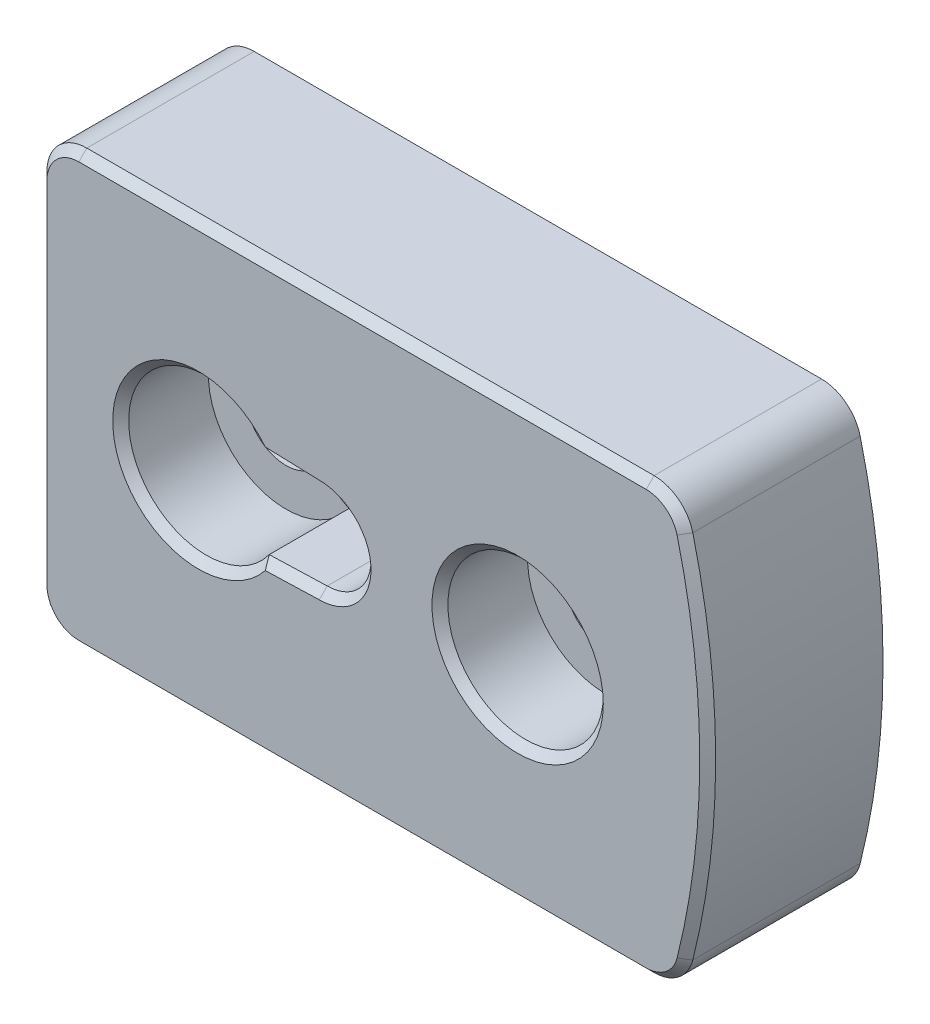
ISO-10303-21;
HEADER;
FILE_DESCRIPTION(('STEP AP214'),'2;1');
FILE_NAME('part.step','',(''),(''),'','','');
FILE_SCHEMA(('AUTOMOTIVE_DESIGN { 1 0 10303 214 1 1 1 1 }'));
ENDSEC;
DATA;
#1=APPLICATION_CONTEXT('core data for automotive mechanical design processes');
#2=APPLICATION_PROTOCOL_DEFINITION('international standard','automotive_design',2000,#1);
#3=PRODUCT_CONTEXT('',#1,'mechanical');
#4=PRODUCT('Part','Part','',(#3));
#5=PRODUCT_RELATED_PRODUCT_CATEGORY('part','',(#4));
#6=PRODUCT_DEFINITION_FORMATION('','',#4);
#7=PRODUCT_DEFINITION_CONTEXT('part definition',#1,'design');
#8=PRODUCT_DEFINITION('design','',#6,#7);
#9=PRODUCT_DEFINITION_SHAPE('','',#8);
#10=(LENGTH_UNIT() NAMED_UNIT(*) SI_UNIT(.MILLI.,.METRE.));
#11=(NAMED_UNIT(*) PLANE_ANGLE_UNIT() SI_UNIT($,.RADIAN.));
#12=(NAMED_UNIT(*) SI_UNIT($,.STERADIAN.) SOLID_ANGLE_UNIT());
#13=UNCERTAINTY_MEASURE_WITH_UNIT(LENGTH_MEASURE(1.E-05),#10,'distance_accuracy_value','');
#14=(GEOMETRIC_REPRESENTATION_CONTEXT(3) GLOBAL_UNCERTAINTY_ASSIGNED_CONTEXT((#13)) GLOBAL_UNIT_ASSIGNED_CONTEXT((#10,
#11,#12)) REPRESENTATION_CONTEXT('',''));
#15=CARTESIAN_POINT('',(0.,0.,0.));
#16=DIRECTION('',(0.,0.,1.));
#17=DIRECTION('',(1.,0.,0.));
#18=AXIS2_PLACEMENT_3D('',#15,#16,#17);
#19=CARTESIAN_POINT('',(10.026646141681,0.,0.));
#20=DIRECTION('',(0.,0.,1.));
#21=DIRECTION('',(1.,0.,0.));
#22=AXIS2_PLACEMENT_3D('',#19,#20,#21);
#23=CYLINDRICAL_SURFACE('',#22,2.5);
#24=CARTESIAN_POINT('',(10.026646141681,0.,0.));
#25=DIRECTION('',(0.,0.,1.));
#26=DIRECTION('',(1.,0.,0.));
#27=AXIS2_PLACEMENT_3D('',#24,#25,#26);
#28=CIRCLE('',#27,2.5);
#29=CARTESIAN_POINT('',(12.526646141681,0.,0.));
#30=VERTEX_POINT('',#29);
#31=EDGE_CURVE('E282',#30,#30,#28,.T.);
#32=ORIENTED_EDGE('',*,*,#31,.F.);
#33=EDGE_LOOP('',(#32));
#34=FACE_BOUND('',#33,.T.);
#35=CARTESIAN_POINT('',(10.026646141681,0.,5.5));
#36=DIRECTION('',(0.,0.,1.));
#37=DIRECTION('',(1.,0.,0.));
#38=AXIS2_PLACEMENT_3D('',#35,#36,#37);
#39=CIRCLE('',#38,2.5);
#40=CARTESIAN_POINT('',(12.526646141681,0.,5.5));
#41=VERTEX_POINT('',#40);
#42=EDGE_CURVE('E270',#41,#41,#39,.F.);
#43=ORIENTED_EDGE('',*,*,#42,.F.);
#44=EDGE_LOOP('',(#43));
#45=FACE_BOUND('',#44,.T.);
#46=ADVANCED_FACE('F45',(#34,#45),#23,.F.);
#47=CARTESIAN_POINT('',(-10.,0.,0.));
#48=DIRECTION('',(0.,0.,1.));
#49=DIRECTION('',(1.,0.,0.));
#50=AXIS2_PLACEMENT_3D('',#47,#48,#49);
#51=CYLINDRICAL_SURFACE('',#50,2.5);
#52=CARTESIAN_POINT('',(-10.,0.,0.));
#53=DIRECTION('',(0.,0.,1.));
#54=DIRECTION('',(1.,0.,0.));
#55=AXIS2_PLACEMENT_3D('',#52,#53,#54);
#56=CIRCLE('',#55,2.5);
#57=CARTESIAN_POINT('',(-7.5,0.,0.));
#58=VERTEX_POINT('',#57);
#59=EDGE_CURVE('E277',#58,#58,#56,.T.);
#60=ORIENTED_EDGE('',*,*,#59,.F.);
#61=EDGE_LOOP('',(#60));
#62=FACE_BOUND('',#61,.T.);
#63=CARTESIAN_POINT('',(-10.,0.,5.5));
#64=DIRECTION('',(0.,0.,1.));
#65=DIRECTION('',(1.,0.,0.));
#66=AXIS2_PLACEMENT_3D('',#63,#64,#65);
#67=CIRCLE('',#66,2.5);
#68=CARTESIAN_POINT('',(-7.5,0.,5.5));
#69=VERTEX_POINT('',#68);
#70=EDGE_CURVE('E264',#69,#69,#67,.F.);
#71=ORIENTED_EDGE('',*,*,#70,.F.);
#72=EDGE_LOOP('',(#71));
#73=FACE_BOUND('',#72,.T.);
#74=ADVANCED_FACE('F499',(#62,#73),#51,.F.);
#75=CARTESIAN_POINT('',(-25.755769230769,0.,11.));
#76=DIRECTION('',(0.,0.,-1.));
#77=DIRECTION('',(-1.,0.,0.));
#78=AXIS2_PLACEMENT_3D('',#75,#76,#77);
#79=CYLINDRICAL_SURFACE('',#78,47.705769230769);
#80=DIRECTION('',(0.,0.,-1.));
#81=VECTOR('',#80,1.);
#82=CARTESIAN_POINT('',(20.5161132212784,11.6083294337857,11.));
#83=LINE('',#82,#81);
#84=CARTESIAN_POINT('',(20.5161132212784,11.6083294337857,0.));
#85=VERTEX_POINT('',#84);
#86=CARTESIAN_POINT('',(20.5161132212784,11.6083294337857,10.5));
#87=VERTEX_POINT('',#86);
#88=EDGE_CURVE('E340',#85,#87,#83,.F.);
#89=ORIENTED_EDGE('',*,*,#88,.T.);
#90=CARTESIAN_POINT('',(-25.755769230769,0.,10.5));
#91=DIRECTION('',(0.,0.,1.));
#92=DIRECTION('',(1.,0.,0.));
#93=AXIS2_PLACEMENT_3D('',#90,#91,#92);
#94=CIRCLE('',#93,47.705769230769);
#95=CARTESIAN_POINT('',(20.5161132212784,-11.6083294337857,10.5));
#96=VERTEX_POINT('',#95);
#97=EDGE_CURVE('E385',#87,#96,#94,.F.);
#98=ORIENTED_EDGE('',*,*,#97,.T.);
#99=DIRECTION('',(0.,0.,-1.));
#100=VECTOR('',#99,1.);
#101=CARTESIAN_POINT('',(20.5161132212784,-11.6083294337857,11.));
#102=LINE('',#101,#100);
#103=CARTESIAN_POINT('',(20.5161132212784,-11.6083294337857,0.));
#104=VERTEX_POINT('',#103);
#105=EDGE_CURVE('E344',#96,#104,#102,.T.);
#106=ORIENTED_EDGE('',*,*,#105,.T.);
#107=CARTESIAN_POINT('',(-25.755769230769,0.,0.));
#108=DIRECTION('',(0.,0.,1.));
#109=DIRECTION('',(1.,0.,0.));
#110=AXIS2_PLACEMENT_3D('',#107,#108,#109);
#111=CIRCLE('',#110,47.705769230769);
#112=EDGE_CURVE('E281',#85,#104,#111,.F.);
#113=ORIENTED_EDGE('',*,*,#112,.F.);
#114=EDGE_LOOP('',(#89,#98,#106,#113));
#115=FACE_BOUND('',#114,.T.);
#116=ADVANCED_FACE('F505',(#115),#79,.T.);
#117=CARTESIAN_POINT('',(0.,13.5,11.));
#118=DIRECTION('',(0.,1.,0.));
#119=DIRECTION('',(0.,0.,1.));
#120=AXIS2_PLACEMENT_3D('',#117,#118,#119);
#121=PLANE('',#120);
#122=DIRECTION('',(0.,0.,-1.));
#123=VECTOR('',#122,1.);
#124=CARTESIAN_POINT('',(-17.5,13.5,11.));
#125=LINE('',#124,#123);
#126=CARTESIAN_POINT('',(-17.5,13.5,0.));
#127=VERTEX_POINT('',#126);
#128=CARTESIAN_POINT('',(-17.5,13.5,10.5));
#129=VERTEX_POINT('',#128);
#130=EDGE_CURVE('E336',#127,#129,#125,.F.);
#131=ORIENTED_EDGE('',*,*,#130,.T.);
#132=DIRECTION('',(1.,0.,0.));
#133=VECTOR('',#132,1.);
#134=CARTESIAN_POINT('',(0.,13.5,10.5));
#135=LINE('',#134,#133);
#136=CARTESIAN_POINT('',(18.0912554316359,13.5,10.5));
#137=VERTEX_POINT('',#136);
#138=EDGE_CURVE('E394',#129,#137,#135,.T.);
#139=ORIENTED_EDGE('',*,*,#138,.T.);
#140=DIRECTION('',(0.,0.,-1.));
#141=VECTOR('',#140,1.);
#142=CARTESIAN_POINT('',(18.0912554316359,13.5,11.));
#143=LINE('',#142,#141);
#144=CARTESIAN_POINT('',(18.0912554316359,13.5,0.));
#145=VERTEX_POINT('',#144);
#146=EDGE_CURVE('E333',#137,#145,#143,.T.);
#147=ORIENTED_EDGE('',*,*,#146,.T.);
#148=DIRECTION('',(1.,0.,0.));
#149=VECTOR('',#148,1.);
#150=CARTESIAN_POINT('',(0.,13.5,0.));
#151=LINE('',#150,#149);
#152=EDGE_CURVE('E289',#127,#145,#151,.T.);
#153=ORIENTED_EDGE('',*,*,#152,.F.);
#154=EDGE_LOOP('',(#131,#139,#147,#153));
#155=FACE_BOUND('',#154,.T.);
#156=ADVANCED_FACE('F527',(#155),#121,.T.);
#157=CARTESIAN_POINT('',(-20.,0.,11.));
#158=DIRECTION('',(-1.,0.,0.));
#159=DIRECTION('',(0.,0.,1.));
#160=AXIS2_PLACEMENT_3D('',#157,#158,#159);
#161=PLANE('',#160);
#162=DIRECTION('',(0.,0.,-1.));
#163=VECTOR('',#162,1.);
#164=CARTESIAN_POINT('',(-20.,-11.,11.));
#165=LINE('',#164,#163);
#166=CARTESIAN_POINT('',(-20.,-11.,0.));
#167=VERTEX_POINT('',#166);
#168=CARTESIAN_POINT('',(-20.,-11.,10.5));
#169=VERTEX_POINT('',#168);
#170=EDGE_CURVE('E329',#167,#169,#165,.F.);
#171=ORIENTED_EDGE('',*,*,#170,.T.);
#172=DIRECTION('',(0.,1.,0.));
#173=VECTOR('',#172,1.);
#174=CARTESIAN_POINT('',(-20.,0.,10.5));
#175=LINE('',#174,#173);
#176=CARTESIAN_POINT('',(-20.,11.,10.5));
#177=VERTEX_POINT('',#176);
#178=EDGE_CURVE('E382',#169,#177,#175,.T.);
#179=ORIENTED_EDGE('',*,*,#178,.T.);
#180=DIRECTION('',(0.,0.,-1.));
#181=VECTOR('',#180,1.);
#182=CARTESIAN_POINT('',(-20.,11.,11.));
#183=LINE('',#182,#181);
#184=CARTESIAN_POINT('',(-20.,11.,0.));
#185=VERTEX_POINT('',#184);
#186=EDGE_CURVE('E326',#177,#185,#183,.T.);
#187=ORIENTED_EDGE('',*,*,#186,.T.);
#188=DIRECTION('',(0.,1.,0.));
#189=VECTOR('',#188,1.);
#190=CARTESIAN_POINT('',(-20.,0.,0.));
#191=LINE('',#190,#189);
#192=EDGE_CURVE('E293',#167,#185,#191,.T.);
#193=ORIENTED_EDGE('',*,*,#192,.F.);
#194=EDGE_LOOP('',(#171,#179,#187,#193));
#195=FACE_BOUND('',#194,.T.);
#196=ADVANCED_FACE('F523',(#195),#161,.T.);
#197=CARTESIAN_POINT('',(0.,-13.5,11.));
#198=DIRECTION('',(0.,1.,0.));
#199=DIRECTION('',(0.,0.,1.));
#200=AXIS2_PLACEMENT_3D('',#197,#198,#199);
#201=PLANE('',#200);
#202=DIRECTION('',(0.,0.,1.));
#203=VECTOR('',#202,1.);
#204=CARTESIAN_POINT('',(18.0912554316359,-13.5,11.));
#205=LINE('',#204,#203);
#206=CARTESIAN_POINT('',(18.0912554316359,-13.5,0.));
#207=VERTEX_POINT('',#206);
#208=CARTESIAN_POINT('',(18.0912554316359,-13.5,10.5));
#209=VERTEX_POINT('',#208);
#210=EDGE_CURVE('E307',#207,#209,#205,.T.);
#211=ORIENTED_EDGE('',*,*,#210,.T.);
#212=DIRECTION('',(-1.,0.,0.));
#213=VECTOR('',#212,1.);
#214=CARTESIAN_POINT('',(-17.5,-13.5,10.5));
#215=LINE('',#214,#213);
#216=CARTESIAN_POINT('',(-17.5,-13.5,10.5));
#217=VERTEX_POINT('',#216);
#218=EDGE_CURVE('E372',#209,#217,#215,.T.);
#219=ORIENTED_EDGE('',*,*,#218,.T.);
#220=DIRECTION('',(0.,0.,-1.));
#221=VECTOR('',#220,1.);
#222=CARTESIAN_POINT('',(-17.5,-13.5,0.));
#223=LINE('',#222,#221);
#224=CARTESIAN_POINT('',(-17.5,-13.5,0.));
#225=VERTEX_POINT('',#224);
#226=EDGE_CURVE('E311',#217,#225,#223,.T.);
#227=ORIENTED_EDGE('',*,*,#226,.T.);
#228=DIRECTION('',(1.,0.,0.));
#229=VECTOR('',#228,1.);
#230=CARTESIAN_POINT('',(0.,-13.5,0.));
#231=LINE('',#230,#229);
#232=EDGE_CURVE('E297',#225,#207,#231,.T.);
#233=ORIENTED_EDGE('',*,*,#232,.T.);
#234=EDGE_LOOP('',(#211,#219,#227,#233));
#235=FACE_BOUND('',#234,.T.);
#236=ADVANCED_FACE('F516',(#235),#201,.F.);
#237=CARTESIAN_POINT('',(0.,0.,11.));
#238=DIRECTION('',(0.,0.,1.));
#239=DIRECTION('',(1.,0.,0.));
#240=AXIS2_PLACEMENT_3D('',#237,#238,#239);
#241=PLANE('',#240);
#242=CARTESIAN_POINT('',(10.026646141681,0.,11.));
#243=DIRECTION('',(0.,0.,1.));
#244=DIRECTION('',(1.,0.,0.));
#245=AXIS2_PLACEMENT_3D('',#242,#243,#244);
#246=CIRCLE('',#245,5.375);
#247=CARTESIAN_POINT('',(15.401646141681,0.,11.));
#248=VERTEX_POINT('',#247);
#249=EDGE_CURVE('E445',#248,#248,#246,.F.);
#250=ORIENTED_EDGE('',*,*,#249,.T.);
#251=EDGE_LOOP('',(#250));
#252=FACE_BOUND('',#251,.T.);
#253=CARTESIAN_POINT('',(-2.42,0.,11.));
#254=DIRECTION('',(0.,0.,1.));
#255=DIRECTION('',(1.,0.,0.));
#256=AXIS2_PLACEMENT_3D('',#253,#254,#255);
#257=CIRCLE('',#256,3.25);
#258=CARTESIAN_POINT('',(-2.4117086415491,3.24998942357901,11.));
#259=VERTEX_POINT('',#258);
#260=CARTESIAN_POINT('',(-2.41170864154912,-3.24998942357895,11.));
#261=VERTEX_POINT('',#260);
#262=EDGE_CURVE('E438',#259,#261,#257,.F.);
#263=ORIENTED_EDGE('',*,*,#262,.T.);
#264=DIRECTION('',(-0.999493332791074,-0.03182888163588,0.));
#265=VECTOR('',#264,1.);
#266=CARTESIAN_POINT('',(-6.04037816880582,-3.3655444644078,11.));
#267=LINE('',#266,#265);
#268=CARTESIAN_POINT('',(-5.80303035242447,-3.35798611928784,11.));
#269=VERTEX_POINT('',#268);
#270=EDGE_CURVE('E441',#261,#269,#267,.T.);
#271=ORIENTED_EDGE('',*,*,#270,.T.);
#272=CARTESIAN_POINT('',(-9.99999999999999,0.,11.));
#273=DIRECTION('',(0.,0.,1.));
#274=DIRECTION('',(1.,0.,0.));
#275=AXIS2_PLACEMENT_3D('',#272,#273,#274);
#276=CIRCLE('',#275,5.375);
#277=CARTESIAN_POINT('',(-5.80303035242447,3.35798611928784,11.));
#278=VERTEX_POINT('',#277);
#279=EDGE_CURVE('E432',#269,#278,#276,.F.);
#280=ORIENTED_EDGE('',*,*,#279,.T.);
#281=DIRECTION('',(0.999493332791074,-0.0318288816358789,0.));
#282=VECTOR('',#281,1.);
#283=CARTESIAN_POINT('',(-2.40408555918206,3.24974666639554,11.));
#284=LINE('',#283,#282);
#285=EDGE_CURVE('E435',#278,#259,#284,.T.);
#286=ORIENTED_EDGE('',*,*,#285,.T.);
#287=EDGE_LOOP('',(#263,#271,#280,#286));
#288=FACE_BOUND('',#287,.T.);
#289=CARTESIAN_POINT('',(-17.5,-11.,11.));
#290=DIRECTION('',(0.,0.,1.));
#291=DIRECTION('',(1.,0.,0.));
#292=AXIS2_PLACEMENT_3D('',#289,#290,#291);
#293=CIRCLE('',#292,1.99999999999999);
#294=CARTESIAN_POINT('',(-19.5,-11.,11.));
#295=VERTEX_POINT('',#294);
#296=CARTESIAN_POINT('',(-17.5,-13.,11.));
#297=VERTEX_POINT('',#296);
#298=EDGE_CURVE('E365',#295,#297,#293,.T.);
#299=ORIENTED_EDGE('',*,*,#298,.T.);
#300=DIRECTION('',(1.,0.,0.));
#301=VECTOR('',#300,1.);
#302=CARTESIAN_POINT('',(18.0912554316359,-13.,11.));
#303=LINE('',#302,#301);
#304=CARTESIAN_POINT('',(18.0912554316359,-13.,11.));
#305=VERTEX_POINT('',#304);
#306=EDGE_CURVE('E368',#297,#305,#303,.T.);
#307=ORIENTED_EDGE('',*,*,#306,.T.);
#308=CARTESIAN_POINT('',(18.0912554316359,-11.,11.));
#309=DIRECTION('',(0.,0.,1.));
#310=DIRECTION('',(1.,0.,0.));
#311=AXIS2_PLACEMENT_3D('',#308,#309,#310);
#312=CIRCLE('',#311,1.99999999999999);
#313=CARTESIAN_POINT('',(20.0311416633499,-11.4866635470285,11.));
#314=VERTEX_POINT('',#313);
#315=EDGE_CURVE('E362',#305,#314,#312,.T.);
#316=ORIENTED_EDGE('',*,*,#315,.T.);
#317=CARTESIAN_POINT('',(-25.755769230769,0.,11.));
#318=DIRECTION('',(0.,0.,1.));
#319=DIRECTION('',(1.,0.,0.));
#320=AXIS2_PLACEMENT_3D('',#317,#318,#319);
#321=CIRCLE('',#320,47.205769230769);
#322=CARTESIAN_POINT('',(20.0311416633499,11.4866635470285,11.));
#323=VERTEX_POINT('',#322);
#324=EDGE_CURVE('E356',#314,#323,#321,.T.);
#325=ORIENTED_EDGE('',*,*,#324,.T.);
#326=CARTESIAN_POINT('',(18.0912554316359,11.,11.));
#327=DIRECTION('',(0.,0.,1.));
#328=DIRECTION('',(1.,0.,0.));
#329=AXIS2_PLACEMENT_3D('',#326,#327,#328);
#330=CIRCLE('',#329,1.99999999999999);
#331=CARTESIAN_POINT('',(18.0912554316359,13.,11.));
#332=VERTEX_POINT('',#331);
#333=EDGE_CURVE('E350',#323,#332,#330,.T.);
#334=ORIENTED_EDGE('',*,*,#333,.T.);
#335=DIRECTION('',(-1.,0.,0.));
#336=VECTOR('',#335,1.);
#337=CARTESIAN_POINT('',(0.,13.,11.));
#338=LINE('',#337,#336);
#339=CARTESIAN_POINT('',(-17.5,13.,11.));
#340=VERTEX_POINT('',#339);
#341=EDGE_CURVE('E347',#332,#340,#338,.T.);
#342=ORIENTED_EDGE('',*,*,#341,.T.);
#343=CARTESIAN_POINT('',(-17.5,11.,11.));
#344=DIRECTION('',(0.,0.,1.));
#345=DIRECTION('',(1.,0.,0.));
#346=AXIS2_PLACEMENT_3D('',#343,#344,#345);
#347=CIRCLE('',#346,1.99999999999999);
#348=CARTESIAN_POINT('',(-19.5,11.,11.));
#349=VERTEX_POINT('',#348);
#350=EDGE_CURVE('E353',#340,#349,#347,.T.);
#351=ORIENTED_EDGE('',*,*,#350,.T.);
#352=DIRECTION('',(0.,-1.,0.));
#353=VECTOR('',#352,1.);
#354=CARTESIAN_POINT('',(-19.5,0.,11.));
#355=LINE('',#354,#353);
#356=EDGE_CURVE('E359',#349,#295,#355,.T.);
#357=ORIENTED_EDGE('',*,*,#356,.T.);
#358=EDGE_LOOP('',(#299,#307,#316,#325,#334,#342,#351,#357));
#359=FACE_BOUND('',#358,.T.);
#360=ADVANCED_FACE('F512',(#252,#288,#359),#241,.T.);
#361=CARTESIAN_POINT('',(0.,0.,0.));
#362=DIRECTION('',(0.,0.,1.));
#363=DIRECTION('',(1.,0.,0.));
#364=AXIS2_PLACEMENT_3D('',#361,#362,#363);
#365=PLANE('',#364);
#366=DIRECTION('',(0.866025403784439,0.5,0.));
#367=VECTOR('',#366,1.);
#368=CARTESIAN_POINT('',(-6.72,2.48260615751539,0.));
#369=LINE('',#368,#367);
#370=CARTESIAN_POINT('',(-6.72,2.48260615751539,0.));
#371=VERTEX_POINT('',#370);
#372=CARTESIAN_POINT('',(-2.42,4.96521231503078,0.));
#373=VERTEX_POINT('',#372);
#374=EDGE_CURVE('E749',#371,#373,#369,.T.);
#375=ORIENTED_EDGE('',*,*,#374,.F.);
#376=DIRECTION('',(0.,1.,0.));
#377=VECTOR('',#376,1.);
#378=CARTESIAN_POINT('',(-6.72,-2.48260615751539,0.));
#379=LINE('',#378,#377);
#380=CARTESIAN_POINT('',(-6.72,-2.48260615751539,0.));
#381=VERTEX_POINT('',#380);
#382=EDGE_CURVE('E752',#381,#371,#379,.T.);
#383=ORIENTED_EDGE('',*,*,#382,.F.);
#384=DIRECTION('',(-0.866025403784439,0.5,0.));
#385=VECTOR('',#384,1.);
#386=CARTESIAN_POINT('',(-2.42,-4.96521231503078,0.));
#387=LINE('',#386,#385);
#388=CARTESIAN_POINT('',(-2.42,-4.96521231503078,0.));
#389=VERTEX_POINT('',#388);
#390=EDGE_CURVE('E428',#389,#381,#387,.T.);
#391=ORIENTED_EDGE('',*,*,#390,.F.);
#392=DIRECTION('',(-0.866025403784439,-0.5,0.));
#393=VECTOR('',#392,1.);
#394=CARTESIAN_POINT('',(1.88,-2.48260615751539,0.));
#395=LINE('',#394,#393);
#396=CARTESIAN_POINT('',(1.88,-2.48260615751539,0.));
#397=VERTEX_POINT('',#396);
#398=EDGE_CURVE('E737',#397,#389,#395,.T.);
#399=ORIENTED_EDGE('',*,*,#398,.F.);
#400=DIRECTION('',(0.,-1.,0.));
#401=VECTOR('',#400,1.);
#402=CARTESIAN_POINT('',(1.88,2.48260615751539,0.));
#403=LINE('',#402,#401);
#404=CARTESIAN_POINT('',(1.88,2.48260615751539,0.));
#405=VERTEX_POINT('',#404);
#406=EDGE_CURVE('E741',#405,#397,#403,.T.);
#407=ORIENTED_EDGE('',*,*,#406,.F.);
#408=DIRECTION('',(0.866025403784439,-0.5,0.));
#409=VECTOR('',#408,1.);
#410=CARTESIAN_POINT('',(-2.42,4.96521231503078,0.));
#411=LINE('',#410,#409);
#412=EDGE_CURVE('E745',#373,#405,#411,.T.);
#413=ORIENTED_EDGE('',*,*,#412,.F.);
#414=EDGE_LOOP('',(#375,#383,#391,#399,#407,#413));
#415=FACE_BOUND('',#414,.T.);
#416=ORIENTED_EDGE('',*,*,#59,.T.);
#417=EDGE_LOOP('',(#416));
#418=FACE_BOUND('',#417,.T.);
#419=ORIENTED_EDGE('',*,*,#31,.T.);
#420=EDGE_LOOP('',(#419));
#421=FACE_BOUND('',#420,.T.);
#422=ORIENTED_EDGE('',*,*,#232,.F.);
#423=CARTESIAN_POINT('',(-17.5,-11.,0.));
#424=DIRECTION('',(0.,0.,1.));
#425=DIRECTION('',(1.,0.,0.));
#426=AXIS2_PLACEMENT_3D('',#423,#424,#425);
#427=CIRCLE('',#426,2.5);
#428=EDGE_CURVE('E323',#225,#167,#427,.F.);
#429=ORIENTED_EDGE('',*,*,#428,.T.);
#430=ORIENTED_EDGE('',*,*,#192,.T.);
#431=CARTESIAN_POINT('',(-17.5,11.,0.));
#432=DIRECTION('',(0.,0.,1.));
#433=DIRECTION('',(1.,0.,0.));
#434=AXIS2_PLACEMENT_3D('',#431,#432,#433);
#435=CIRCLE('',#434,2.5);
#436=EDGE_CURVE('E320',#185,#127,#435,.F.);
#437=ORIENTED_EDGE('',*,*,#436,.T.);
#438=ORIENTED_EDGE('',*,*,#152,.T.);
#439=CARTESIAN_POINT('',(18.0912554316359,11.,0.));
#440=DIRECTION('',(0.,0.,1.));
#441=DIRECTION('',(1.,0.,0.));
#442=AXIS2_PLACEMENT_3D('',#439,#440,#441);
#443=CIRCLE('',#442,2.5);
#444=EDGE_CURVE('E314',#145,#85,#443,.F.);
#445=ORIENTED_EDGE('',*,*,#444,.T.);
#446=ORIENTED_EDGE('',*,*,#112,.T.);
#447=CARTESIAN_POINT('',(18.0912554316359,-11.,0.));
#448=DIRECTION('',(0.,0.,1.));
#449=DIRECTION('',(1.,0.,0.));
#450=AXIS2_PLACEMENT_3D('',#447,#448,#449);
#451=CIRCLE('',#450,2.5);
#452=EDGE_CURVE('E317',#104,#207,#451,.F.);
#453=ORIENTED_EDGE('',*,*,#452,.T.);
#454=EDGE_LOOP('',(#422,#429,#430,#437,#438,#445,#446,#453));
#455=FACE_BOUND('',#454,.T.);
#456=ADVANCED_FACE('F515',(#415,#418,#421,#455),#365,.F.);
#457=CARTESIAN_POINT('',(0.,0.,5.5));
#458=DIRECTION('',(0.,0.,1.));
#459=DIRECTION('',(1.,0.,0.));
#460=AXIS2_PLACEMENT_3D('',#457,#458,#459);
#461=PLANE('',#460);
#462=DIRECTION('',(0.866025403784439,0.5,0.));
#463=VECTOR('',#462,1.);
#464=CARTESIAN_POINT('',(-6.72,2.48260615751539,5.5));
#465=LINE('',#464,#463);
#466=CARTESIAN_POINT('',(-6.72,2.48260615751539,5.5));
#467=VERTEX_POINT('',#466);
#468=CARTESIAN_POINT('',(-6.05629260962376,2.86579779801226,5.5));
#469=VERTEX_POINT('',#468);
#470=EDGE_CURVE('E262',#467,#469,#465,.T.);
#471=ORIENTED_EDGE('',*,*,#470,.T.);
#472=CARTESIAN_POINT('',(-9.99999999999999,0.,5.5));
#473=DIRECTION('',(0.,0.,1.));
#474=DIRECTION('',(1.,0.,0.));
#475=AXIS2_PLACEMENT_3D('',#472,#473,#474);
#476=CIRCLE('',#475,4.875);
#477=CARTESIAN_POINT('',(-6.05629260962376,-2.86579779801226,5.5));
#478=VERTEX_POINT('',#477);
#479=EDGE_CURVE('E234',#478,#469,#476,.F.);
#480=ORIENTED_EDGE('',*,*,#479,.F.);
#481=DIRECTION('',(-0.866025403784439,0.5,0.));
#482=VECTOR('',#481,1.);
#483=CARTESIAN_POINT('',(-2.42,-4.96521231503078,5.5));
#484=LINE('',#483,#482);
#485=CARTESIAN_POINT('',(-6.72,-2.48260615751539,5.5));
#486=VERTEX_POINT('',#485);
#487=EDGE_CURVE('E242',#478,#486,#484,.T.);
#488=ORIENTED_EDGE('',*,*,#487,.T.);
#489=DIRECTION('',(0.,1.,0.));
#490=VECTOR('',#489,1.);
#491=CARTESIAN_POINT('',(-6.72,-2.48260615751539,5.5));
#492=LINE('',#491,#490);
#493=EDGE_CURVE('E740',#486,#467,#492,.T.);
#494=ORIENTED_EDGE('',*,*,#493,.T.);
#495=EDGE_LOOP('',(#471,#480,#488,#494));
#496=FACE_BOUND('',#495,.T.);
#497=ORIENTED_EDGE('',*,*,#70,.T.);
#498=EDGE_LOOP('',(#497));
#499=FACE_BOUND('',#498,.T.);
#500=ADVANCED_FACE('F260',(#496,#499),#461,.T.);
#501=CARTESIAN_POINT('',(-9.99999999999999,0.,-13.7885822331377));
#502=DIRECTION('',(0.,0.,1.));
#503=DIRECTION('',(1.,0.,0.));
#504=AXIS2_PLACEMENT_3D('',#501,#502,#503);
#505=CYLINDRICAL_SURFACE('',#504,4.875);
#506=DIRECTION('',(0.,0.,1.));
#507=VECTOR('',#506,1.);
#508=CARTESIAN_POINT('',(-6.05629260962376,2.86579779801225,0.));
#509=LINE('',#508,#507);
#510=CARTESIAN_POINT('',(-6.05629260962376,2.86579779801225,10.5));
#511=VERTEX_POINT('',#510);
#512=EDGE_CURVE('E237',#469,#511,#509,.T.);
#513=ORIENTED_EDGE('',*,*,#512,.T.);
#514=CARTESIAN_POINT('',(-9.99999999999999,0.,10.5));
#515=DIRECTION('',(0.,0.,1.));
#516=DIRECTION('',(1.,0.,0.));
#517=AXIS2_PLACEMENT_3D('',#514,#515,#516);
#518=CIRCLE('',#517,4.875);
#519=CARTESIAN_POINT('',(-6.05629260962376,-2.86579779801226,10.5));
#520=VERTEX_POINT('',#519);
#521=EDGE_CURVE('E12',#511,#520,#518,.T.);
#522=ORIENTED_EDGE('',*,*,#521,.T.);
#523=DIRECTION('',(0.,0.,1.));
#524=VECTOR('',#523,1.);
#525=CARTESIAN_POINT('',(-6.05629260962376,-2.86579779801226,0.));
#526=LINE('',#525,#524);
#527=EDGE_CURVE('E219',#478,#520,#526,.T.);
#528=ORIENTED_EDGE('',*,*,#527,.F.);
#529=ORIENTED_EDGE('',*,*,#479,.T.);
#530=EDGE_LOOP('',(#513,#522,#528,#529));
#531=FACE_BOUND('',#530,.T.);
#532=ADVANCED_FACE('F232',(#531),#505,.F.);
#533=CARTESIAN_POINT('',(0.,0.,5.5));
#534=DIRECTION('',(0.,0.,1.));
#535=DIRECTION('',(1.,0.,0.));
#536=AXIS2_PLACEMENT_3D('',#533,#534,#535);
#537=PLANE('',#536);
#538=CARTESIAN_POINT('',(10.026646141681,0.,5.5));
#539=DIRECTION('',(0.,0.,1.));
#540=DIRECTION('',(1.,0.,0.));
#541=AXIS2_PLACEMENT_3D('',#538,#539,#540);
#542=CIRCLE('',#541,4.875);
#543=CARTESIAN_POINT('',(14.901646141681,0.,5.5));
#544=VERTEX_POINT('',#543);
#545=EDGE_CURVE('E265',#544,#544,#542,.F.);
#546=ORIENTED_EDGE('',*,*,#545,.F.);
#547=EDGE_LOOP('',(#546));
#548=FACE_BOUND('',#547,.T.);
#549=ORIENTED_EDGE('',*,*,#42,.T.);
#550=EDGE_LOOP('',(#549));
#551=FACE_BOUND('',#550,.T.);
#552=ADVANCED_FACE('F624',(#548,#551),#537,.T.);
#553=CARTESIAN_POINT('',(10.026646141681,0.,-13.7885822331377));
#554=DIRECTION('',(0.,0.,1.));
#555=DIRECTION('',(1.,0.,0.));
#556=AXIS2_PLACEMENT_3D('',#553,#554,#555);
#557=CYLINDRICAL_SURFACE('',#556,4.875);
#558=CARTESIAN_POINT('',(10.026646141681,0.,10.5));
#559=DIRECTION('',(0.,0.,1.));
#560=DIRECTION('',(1.,0.,0.));
#561=AXIS2_PLACEMENT_3D('',#558,#559,#560);
#562=CIRCLE('',#561,4.875);
#563=CARTESIAN_POINT('',(14.901646141681,0.,10.5));
#564=VERTEX_POINT('',#563);
#565=EDGE_CURVE('E397',#564,#564,#562,.T.);
#566=ORIENTED_EDGE('',*,*,#565,.T.);
#567=EDGE_LOOP('',(#566));
#568=FACE_BOUND('',#567,.T.);
#569=ORIENTED_EDGE('',*,*,#545,.T.);
#570=EDGE_LOOP('',(#569));
#571=FACE_BOUND('',#570,.T.);
#572=ADVANCED_FACE('F620',(#568,#571),#557,.F.);
#573=CARTESIAN_POINT('',(-2.42,0.,0.));
#574=DIRECTION('',(0.,0.,1.));
#575=DIRECTION('',(1.,0.,0.));
#576=AXIS2_PLACEMENT_3D('',#573,#574,#575);
#577=CYLINDRICAL_SURFACE('',#576,2.75);
#578=DIRECTION('',(0.,0.,1.));
#579=VECTOR('',#578,1.);
#580=CARTESIAN_POINT('',(-2.42,-2.75,0.));
#581=LINE('',#580,#579);
#582=CARTESIAN_POINT('',(-2.42,-2.75,5.5));
#583=VERTEX_POINT('',#582);
#584=CARTESIAN_POINT('',(-2.42,-2.75,10.5));
#585=VERTEX_POINT('',#584);
#586=EDGE_CURVE('E221',#583,#585,#581,.T.);
#587=ORIENTED_EDGE('',*,*,#586,.T.);
#588=CARTESIAN_POINT('',(-2.42,0.,10.5));
#589=DIRECTION('',(0.,0.,1.));
#590=DIRECTION('',(1.,0.,0.));
#591=AXIS2_PLACEMENT_3D('',#588,#589,#590);
#592=CIRCLE('',#591,2.75);
#593=CARTESIAN_POINT('',(-2.42,2.75,10.5));
#594=VERTEX_POINT('',#593);
#595=EDGE_CURVE('E76',#585,#594,#592,.T.);
#596=ORIENTED_EDGE('',*,*,#595,.T.);
#597=DIRECTION('',(0.,0.,1.));
#598=VECTOR('',#597,1.);
#599=CARTESIAN_POINT('',(-2.42,2.75,0.));
#600=LINE('',#599,#598);
#601=CARTESIAN_POINT('',(-2.42,2.75,5.5));
#602=VERTEX_POINT('',#601);
#603=EDGE_CURVE('E667',#602,#594,#600,.T.);
#604=ORIENTED_EDGE('',*,*,#603,.F.);
#605=CARTESIAN_POINT('',(-2.42,0.,5.5));
#606=DIRECTION('',(0.,0.,1.));
#607=DIRECTION('',(1.,0.,0.));
#608=AXIS2_PLACEMENT_3D('',#605,#606,#607);
#609=CIRCLE('',#608,2.75);
#610=EDGE_CURVE('E300',#602,#583,#609,.F.);
#611=ORIENTED_EDGE('',*,*,#610,.T.);
#612=EDGE_LOOP('',(#587,#596,#604,#611));
#613=FACE_BOUND('',#612,.T.);
#614=ADVANCED_FACE('F623',(#613),#577,.F.);
#615=CARTESIAN_POINT('',(0.,0.,5.5));
#616=DIRECTION('',(0.,0.,1.));
#617=DIRECTION('',(1.,0.,0.));
#618=AXIS2_PLACEMENT_3D('',#615,#616,#617);
#619=PLANE('',#618);
#620=CARTESIAN_POINT('',(-2.42,-4.96521231503078,5.5));
#621=VERTEX_POINT('',#620);
#622=EDGE_CURVE('E245',#621,#478,#484,.T.);
#623=ORIENTED_EDGE('',*,*,#622,.T.);
#624=DIRECTION('',(0.999493332791074,0.03182888163588,0.));
#625=VECTOR('',#624,1.);
#626=CARTESIAN_POINT('',(0.0850334281604785,-2.67022716924365,5.5));
#627=LINE('',#626,#625);
#628=EDGE_CURVE('E215',#478,#583,#627,.T.);
#629=ORIENTED_EDGE('',*,*,#628,.T.);
#630=ORIENTED_EDGE('',*,*,#610,.F.);
#631=DIRECTION('',(-0.999493332791074,0.0318288816358789,0.));
#632=VECTOR('',#631,1.);
#633=CARTESIAN_POINT('',(0.0850334281604757,2.67022716924365,5.5));
#634=LINE('',#633,#632);
#635=EDGE_CURVE('E227',#602,#469,#634,.T.);
#636=ORIENTED_EDGE('',*,*,#635,.T.);
#637=CARTESIAN_POINT('',(-2.42,4.96521231503078,5.5));
#638=VERTEX_POINT('',#637);
#639=EDGE_CURVE('E775',#469,#638,#465,.T.);
#640=ORIENTED_EDGE('',*,*,#639,.T.);
#641=DIRECTION('',(0.866025403784439,-0.5,0.));
#642=VECTOR('',#641,1.);
#643=CARTESIAN_POINT('',(-2.42,4.96521231503078,5.5));
#644=LINE('',#643,#642);
#645=CARTESIAN_POINT('',(1.88,2.48260615751539,5.5));
#646=VERTEX_POINT('',#645);
#647=EDGE_CURVE('E768',#638,#646,#644,.T.);
#648=ORIENTED_EDGE('',*,*,#647,.T.);
#649=DIRECTION('',(0.,-1.,0.));
#650=VECTOR('',#649,1.);
#651=CARTESIAN_POINT('',(1.88,2.48260615751539,5.5));
#652=LINE('',#651,#650);
#653=CARTESIAN_POINT('',(1.88,-2.48260615751539,5.5));
#654=VERTEX_POINT('',#653);
#655=EDGE_CURVE('E764',#646,#654,#652,.T.);
#656=ORIENTED_EDGE('',*,*,#655,.T.);
#657=DIRECTION('',(-0.866025403784439,-0.5,0.));
#658=VECTOR('',#657,1.);
#659=CARTESIAN_POINT('',(1.88,-2.48260615751539,5.5));
#660=LINE('',#659,#658);
#661=EDGE_CURVE('E257',#654,#621,#660,.T.);
#662=ORIENTED_EDGE('',*,*,#661,.T.);
#663=EDGE_LOOP('',(#623,#629,#630,#636,#640,#648,#656,#662));
#664=FACE_BOUND('',#663,.T.);
#665=ADVANCED_FACE('F255',(#664),#619,.F.);
#666=CARTESIAN_POINT('',(-6.72,-2.48260615751539,18.6367169922067));
#667=DIRECTION('',(-1.,0.,0.));
#668=DIRECTION('',(0.,-1.,0.));
#669=AXIS2_PLACEMENT_3D('',#666,#667,#668);
#670=PLANE('',#669);
#671=DIRECTION('',(0.,0.,-1.));
#672=VECTOR('',#671,1.);
#673=CARTESIAN_POINT('',(-6.72,-2.48260615751539,18.6367169922067));
#674=LINE('',#673,#672);
#675=EDGE_CURVE('E248',#486,#381,#674,.T.);
#676=ORIENTED_EDGE('',*,*,#675,.T.);
#677=ORIENTED_EDGE('',*,*,#382,.T.);
#678=DIRECTION('',(0.,0.,-1.));
#679=VECTOR('',#678,1.);
#680=CARTESIAN_POINT('',(-6.72,2.48260615751539,18.6367169922067));
#681=LINE('',#680,#679);
#682=EDGE_CURVE('E759',#467,#371,#681,.T.);
#683=ORIENTED_EDGE('',*,*,#682,.F.);
#684=ORIENTED_EDGE('',*,*,#493,.F.);
#685=EDGE_LOOP('',(#676,#677,#683,#684));
#686=FACE_BOUND('',#685,.T.);
#687=ADVANCED_FACE('F642',(#686),#670,.F.);
#688=CARTESIAN_POINT('',(-6.72,2.48260615751539,18.6367169922067));
#689=DIRECTION('',(-0.5,0.866025403784439,0.));
#690=DIRECTION('',(-0.866025403784439,-0.5,0.));
#691=AXIS2_PLACEMENT_3D('',#688,#689,#690);
#692=PLANE('',#691);
#693=ORIENTED_EDGE('',*,*,#639,.F.);
#694=ORIENTED_EDGE('',*,*,#470,.F.);
#695=ORIENTED_EDGE('',*,*,#682,.T.);
#696=ORIENTED_EDGE('',*,*,#374,.T.);
#697=DIRECTION('',(0.,0.,-1.));
#698=VECTOR('',#697,1.);
#699=CARTESIAN_POINT('',(-2.42,4.96521231503078,18.6367169922067));
#700=LINE('',#699,#698);
#701=EDGE_CURVE('E772',#638,#373,#700,.T.);
#702=ORIENTED_EDGE('',*,*,#701,.F.);
#703=EDGE_LOOP('',(#693,#694,#695,#696,#702));
#704=FACE_BOUND('',#703,.T.);
#705=ADVANCED_FACE('F645',(#704),#692,.F.);
#706=CARTESIAN_POINT('',(-2.42,4.96521231503078,18.6367169922067));
#707=DIRECTION('',(0.5,0.866025403784439,0.));
#708=DIRECTION('',(-0.866025403784439,0.5,0.));
#709=AXIS2_PLACEMENT_3D('',#706,#707,#708);
#710=PLANE('',#709);
#711=ORIENTED_EDGE('',*,*,#701,.T.);
#712=ORIENTED_EDGE('',*,*,#412,.T.);
#713=DIRECTION('',(0.,0.,-1.));
#714=VECTOR('',#713,1.);
#715=CARTESIAN_POINT('',(1.88,2.48260615751539,18.6367169922067));
#716=LINE('',#715,#714);
#717=EDGE_CURVE('E767',#646,#405,#716,.T.);
#718=ORIENTED_EDGE('',*,*,#717,.F.);
#719=ORIENTED_EDGE('',*,*,#647,.F.);
#720=EDGE_LOOP('',(#711,#712,#718,#719));
#721=FACE_BOUND('',#720,.T.);
#722=ADVANCED_FACE('F649',(#721),#710,.F.);
#723=CARTESIAN_POINT('',(1.88,2.48260615751539,18.6367169922067));
#724=DIRECTION('',(1.,0.,0.));
#725=DIRECTION('',(0.,1.,0.));
#726=AXIS2_PLACEMENT_3D('',#723,#724,#725);
#727=PLANE('',#726);
#728=ORIENTED_EDGE('',*,*,#717,.T.);
#729=ORIENTED_EDGE('',*,*,#406,.T.);
#730=DIRECTION('',(0.,0.,-1.));
#731=VECTOR('',#730,1.);
#732=CARTESIAN_POINT('',(1.88,-2.48260615751539,18.6367169922067));
#733=LINE('',#732,#731);
#734=EDGE_CURVE('E763',#654,#397,#733,.T.);
#735=ORIENTED_EDGE('',*,*,#734,.F.);
#736=ORIENTED_EDGE('',*,*,#655,.F.);
#737=EDGE_LOOP('',(#728,#729,#735,#736));
#738=FACE_BOUND('',#737,.T.);
#739=ADVANCED_FACE('F653',(#738),#727,.F.);
#740=CARTESIAN_POINT('',(1.88,-2.48260615751539,18.6367169922067));
#741=DIRECTION('',(0.5,-0.866025403784439,0.));
#742=DIRECTION('',(0.866025403784439,0.5,0.));
#743=AXIS2_PLACEMENT_3D('',#740,#741,#742);
#744=PLANE('',#743);
#745=ORIENTED_EDGE('',*,*,#734,.T.);
#746=ORIENTED_EDGE('',*,*,#398,.T.);
#747=DIRECTION('',(0.,0.,-1.));
#748=VECTOR('',#747,1.);
#749=CARTESIAN_POINT('',(-2.42,-4.96521231503078,18.6367169922067));
#750=LINE('',#749,#748);
#751=EDGE_CURVE('E252',#621,#389,#750,.T.);
#752=ORIENTED_EDGE('',*,*,#751,.F.);
#753=ORIENTED_EDGE('',*,*,#661,.F.);
#754=EDGE_LOOP('',(#745,#746,#752,#753));
#755=FACE_BOUND('',#754,.T.);
#756=ADVANCED_FACE('F657',(#755),#744,.F.);
#757=CARTESIAN_POINT('',(-2.42,-4.96521231503078,18.6367169922067));
#758=DIRECTION('',(-0.5,-0.866025403784439,0.));
#759=DIRECTION('',(0.866025403784439,-0.5,0.));
#760=AXIS2_PLACEMENT_3D('',#757,#758,#759);
#761=PLANE('',#760);
#762=ORIENTED_EDGE('',*,*,#390,.T.);
#763=ORIENTED_EDGE('',*,*,#675,.F.);
#764=ORIENTED_EDGE('',*,*,#487,.F.);
#765=ORIENTED_EDGE('',*,*,#622,.F.);
#766=ORIENTED_EDGE('',*,*,#751,.T.);
#767=EDGE_LOOP('',(#762,#763,#764,#765,#766));
#768=FACE_BOUND('',#767,.T.);
#769=ADVANCED_FACE('F243',(#768),#761,.F.);
#770=CARTESIAN_POINT('',(-17.5,-11.,11.));
#771=DIRECTION('',(0.,0.,1.));
#772=DIRECTION('',(1.,0.,0.));
#773=AXIS2_PLACEMENT_3D('',#770,#771,#772);
#774=CYLINDRICAL_SURFACE('',#773,2.5);
#775=ORIENTED_EDGE('',*,*,#226,.F.);
#776=CARTESIAN_POINT('',(-17.5,-11.,10.5));
#777=DIRECTION('',(0.,0.,1.));
#778=DIRECTION('',(1.,0.,0.));
#779=AXIS2_PLACEMENT_3D('',#776,#777,#778);
#780=CIRCLE('',#779,2.5);
#781=EDGE_CURVE('E376',#217,#169,#780,.F.);
#782=ORIENTED_EDGE('',*,*,#781,.T.);
#783=ORIENTED_EDGE('',*,*,#170,.F.);
#784=ORIENTED_EDGE('',*,*,#428,.F.);
#785=EDGE_LOOP('',(#775,#782,#783,#784));
#786=FACE_BOUND('',#785,.T.);
#787=ADVANCED_FACE('F535',(#786),#774,.T.);
#788=CARTESIAN_POINT('',(-17.5,11.,11.));
#789=DIRECTION('',(0.,0.,-1.));
#790=DIRECTION('',(-1.,0.,0.));
#791=AXIS2_PLACEMENT_3D('',#788,#789,#790);
#792=CYLINDRICAL_SURFACE('',#791,2.5);
#793=ORIENTED_EDGE('',*,*,#186,.F.);
#794=CARTESIAN_POINT('',(-17.5,11.,10.5));
#795=DIRECTION('',(0.,0.,1.));
#796=DIRECTION('',(1.,0.,0.));
#797=AXIS2_PLACEMENT_3D('',#794,#795,#796);
#798=CIRCLE('',#797,2.5);
#799=EDGE_CURVE('E388',#177,#129,#798,.F.);
#800=ORIENTED_EDGE('',*,*,#799,.T.);
#801=ORIENTED_EDGE('',*,*,#130,.F.);
#802=ORIENTED_EDGE('',*,*,#436,.F.);
#803=EDGE_LOOP('',(#793,#800,#801,#802));
#804=FACE_BOUND('',#803,.T.);
#805=ADVANCED_FACE('F538',(#804),#792,.T.);
#806=CARTESIAN_POINT('',(18.0912554316359,-11.,11.));
#807=DIRECTION('',(0.,0.,-1.));
#808=DIRECTION('',(-1.,0.,0.));
#809=AXIS2_PLACEMENT_3D('',#806,#807,#808);
#810=CYLINDRICAL_SURFACE('',#809,2.5);
#811=ORIENTED_EDGE('',*,*,#105,.F.);
#812=CARTESIAN_POINT('',(18.0912554316359,-11.,10.5));
#813=DIRECTION('',(0.,0.,1.));
#814=DIRECTION('',(1.,0.,0.));
#815=AXIS2_PLACEMENT_3D('',#812,#813,#814);
#816=CIRCLE('',#815,2.5);
#817=EDGE_CURVE('E379',#96,#209,#816,.F.);
#818=ORIENTED_EDGE('',*,*,#817,.T.);
#819=ORIENTED_EDGE('',*,*,#210,.F.);
#820=ORIENTED_EDGE('',*,*,#452,.F.);
#821=EDGE_LOOP('',(#811,#818,#819,#820));
#822=FACE_BOUND('',#821,.T.);
#823=ADVANCED_FACE('F542',(#822),#810,.T.);
#824=CARTESIAN_POINT('',(18.0912554316359,11.,11.));
#825=DIRECTION('',(0.,0.,-1.));
#826=DIRECTION('',(-1.,0.,0.));
#827=AXIS2_PLACEMENT_3D('',#824,#825,#826);
#828=CYLINDRICAL_SURFACE('',#827,2.5);
#829=ORIENTED_EDGE('',*,*,#146,.F.);
#830=CARTESIAN_POINT('',(18.0912554316359,11.,10.5));
#831=DIRECTION('',(0.,0.,1.));
#832=DIRECTION('',(1.,0.,0.));
#833=AXIS2_PLACEMENT_3D('',#830,#831,#832);
#834=CIRCLE('',#833,2.5);
#835=EDGE_CURVE('E391',#137,#87,#834,.F.);
#836=ORIENTED_EDGE('',*,*,#835,.T.);
#837=ORIENTED_EDGE('',*,*,#88,.F.);
#838=ORIENTED_EDGE('',*,*,#444,.F.);
#839=EDGE_LOOP('',(#829,#836,#837,#838));
#840=FACE_BOUND('',#839,.T.);
#841=ADVANCED_FACE('F546',(#840),#828,.T.);
#842=CARTESIAN_POINT('',(0.,13.5,10.5));
#843=DIRECTION('',(0.,-0.707106781186547,-0.707106781186547));
#844=DIRECTION('',(1.,0.,0.));
#845=AXIS2_PLACEMENT_3D('',#842,#843,#844);
#846=PLANE('',#845);
#847=DIRECTION('',(0.,-0.707106781186547,0.707106781186547));
#848=VECTOR('',#847,1.);
#849=CARTESIAN_POINT('',(18.0912554316359,13.5,10.5));
#850=LINE('',#849,#848);
#851=EDGE_CURVE('E420',#137,#332,#850,.T.);
#852=ORIENTED_EDGE('',*,*,#851,.F.);
#853=ORIENTED_EDGE('',*,*,#138,.F.);
#854=DIRECTION('',(0.,0.707106781186547,-0.707106781186547));
#855=VECTOR('',#854,1.);
#856=CARTESIAN_POINT('',(-17.5,13.,11.));
#857=LINE('',#856,#855);
#858=EDGE_CURVE('E424',#340,#129,#857,.T.);
#859=ORIENTED_EDGE('',*,*,#858,.F.);
#860=ORIENTED_EDGE('',*,*,#341,.F.);
#861=EDGE_LOOP('',(#852,#853,#859,#860));
#862=FACE_BOUND('',#861,.T.);
#863=ADVANCED_FACE('F550',(#862),#846,.F.);
#864=CARTESIAN_POINT('',(-17.5,11.,11.));
#865=DIRECTION('',(0.,0.,-1.));
#866=DIRECTION('',(-1.,0.,0.));
#867=AXIS2_PLACEMENT_3D('',#864,#865,#866);
#868=CONICAL_SURFACE('',#867,1.99999999999999,0.785398163397448);
#869=ORIENTED_EDGE('',*,*,#858,.T.);
#870=ORIENTED_EDGE('',*,*,#799,.F.);
#871=DIRECTION('',(-0.707106781186547,0.,-0.707106781186547));
#872=VECTOR('',#871,1.);
#873=CARTESIAN_POINT('',(-19.5,11.,11.));
#874=LINE('',#873,#872);
#875=EDGE_CURVE('E416',#349,#177,#874,.T.);
#876=ORIENTED_EDGE('',*,*,#875,.F.);
#877=ORIENTED_EDGE('',*,*,#350,.F.);
#878=EDGE_LOOP('',(#869,#870,#876,#877));
#879=FACE_BOUND('',#878,.T.);
#880=ADVANCED_FACE('F596',(#879),#868,.T.);
#881=CARTESIAN_POINT('',(18.0912554316359,11.,11.));
#882=DIRECTION('',(0.,0.,-1.));
#883=DIRECTION('',(-1.,0.,0.));
#884=AXIS2_PLACEMENT_3D('',#881,#882,#883);
#885=CONICAL_SURFACE('',#884,1.99999999999999,0.78539816339745);
#886=ORIENTED_EDGE('',*,*,#851,.T.);
#887=ORIENTED_EDGE('',*,*,#333,.F.);
#888=DIRECTION('',(-0.6858533545877,-0.172061547130091,0.707106781186546));
#889=VECTOR('',#888,1.);
#890=CARTESIAN_POINT('',(20.5161132212784,11.6083294337857,10.5));
#891=LINE('',#890,#889);
#892=EDGE_CURVE('E412',#87,#323,#891,.T.);
#893=ORIENTED_EDGE('',*,*,#892,.F.);
#894=ORIENTED_EDGE('',*,*,#835,.F.);
#895=EDGE_LOOP('',(#886,#887,#893,#894));
#896=FACE_BOUND('',#895,.T.);
#897=ADVANCED_FACE('F589',(#896),#885,.T.);
#898=CARTESIAN_POINT('',(-20.,0.,10.5));
#899=DIRECTION('',(0.707106781186547,0.,-0.707106781186547));
#900=DIRECTION('',(0.,1.,0.));
#901=AXIS2_PLACEMENT_3D('',#898,#899,#900);
#902=PLANE('',#901);
#903=ORIENTED_EDGE('',*,*,#875,.T.);
#904=ORIENTED_EDGE('',*,*,#178,.F.);
#905=DIRECTION('',(-0.707106781186547,0.,-0.707106781186547));
#906=VECTOR('',#905,1.);
#907=CARTESIAN_POINT('',(-19.5,-11.,11.));
#908=LINE('',#907,#906);
#909=EDGE_CURVE('E408',#295,#169,#908,.T.);
#910=ORIENTED_EDGE('',*,*,#909,.F.);
#911=ORIENTED_EDGE('',*,*,#356,.F.);
#912=EDGE_LOOP('',(#903,#904,#910,#911));
#913=FACE_BOUND('',#912,.T.);
#914=ADVANCED_FACE('F582',(#913),#902,.F.);
#915=CARTESIAN_POINT('',(-25.755769230769,0.,10.5));
#916=DIRECTION('',(0.,0.,-1.));
#917=DIRECTION('',(-1.,0.,0.));
#918=AXIS2_PLACEMENT_3D('',#915,#916,#917);
#919=CONICAL_SURFACE('',#918,47.705769230769,0.785398163397448);
#920=ORIENTED_EDGE('',*,*,#892,.T.);
#921=ORIENTED_EDGE('',*,*,#324,.F.);
#922=DIRECTION('',(-0.685853354587698,0.172061547130092,0.707106781186548));
#923=VECTOR('',#922,1.);
#924=CARTESIAN_POINT('',(20.5161132212784,-11.6083294337857,10.5));
#925=LINE('',#924,#923);
#926=EDGE_CURVE('E404',#96,#314,#925,.T.);
#927=ORIENTED_EDGE('',*,*,#926,.F.);
#928=ORIENTED_EDGE('',*,*,#97,.F.);
#929=EDGE_LOOP('',(#920,#921,#927,#928));
#930=FACE_BOUND('',#929,.T.);
#931=ADVANCED_FACE('F575',(#930),#919,.T.);
#932=CARTESIAN_POINT('',(-17.5,-11.,11.));
#933=DIRECTION('',(0.,0.,-1.));
#934=DIRECTION('',(-1.,0.,0.));
#935=AXIS2_PLACEMENT_3D('',#932,#933,#934);
#936=CONICAL_SURFACE('',#935,1.99999999999999,0.78539816339745);
#937=ORIENTED_EDGE('',*,*,#909,.T.);
#938=ORIENTED_EDGE('',*,*,#781,.F.);
#939=DIRECTION('',(0.,-0.707106781186549,-0.707106781186546));
#940=VECTOR('',#939,1.);
#941=CARTESIAN_POINT('',(-17.5,-13.,11.));
#942=LINE('',#941,#940);
#943=EDGE_CURVE('E401',#297,#217,#942,.T.);
#944=ORIENTED_EDGE('',*,*,#943,.F.);
#945=ORIENTED_EDGE('',*,*,#298,.F.);
#946=EDGE_LOOP('',(#937,#938,#944,#945));
#947=FACE_BOUND('',#946,.T.);
#948=ADVANCED_FACE('F568',(#947),#936,.T.);
#949=CARTESIAN_POINT('',(18.0912554316359,-11.,11.));
#950=DIRECTION('',(0.,0.,-1.));
#951=DIRECTION('',(-1.,0.,0.));
#952=AXIS2_PLACEMENT_3D('',#949,#950,#951);
#953=CONICAL_SURFACE('',#952,1.99999999999999,0.785398163397448);
#954=ORIENTED_EDGE('',*,*,#926,.T.);
#955=ORIENTED_EDGE('',*,*,#315,.F.);
#956=DIRECTION('',(0.,0.707106781186546,0.707106781186549));
#957=VECTOR('',#956,1.);
#958=CARTESIAN_POINT('',(18.0912554316359,-13.5,10.5));
#959=LINE('',#958,#957);
#960=EDGE_CURVE('E398',#209,#305,#959,.T.);
#961=ORIENTED_EDGE('',*,*,#960,.F.);
#962=ORIENTED_EDGE('',*,*,#817,.F.);
#963=EDGE_LOOP('',(#954,#955,#961,#962));
#964=FACE_BOUND('',#963,.T.);
#965=ADVANCED_FACE('F561',(#964),#953,.T.);
#966=CARTESIAN_POINT('',(0.,-13.,11.));
#967=DIRECTION('',(0.,-0.707106781186547,0.707106781186547));
#968=DIRECTION('',(-1.,0.,0.));
#969=AXIS2_PLACEMENT_3D('',#966,#967,#968);
#970=PLANE('',#969);
#971=ORIENTED_EDGE('',*,*,#943,.T.);
#972=ORIENTED_EDGE('',*,*,#218,.F.);
#973=ORIENTED_EDGE('',*,*,#960,.T.);
#974=ORIENTED_EDGE('',*,*,#306,.F.);
#975=EDGE_LOOP('',(#971,#972,#973,#974));
#976=FACE_BOUND('',#975,.T.);
#977=ADVANCED_FACE('F553',(#976),#970,.T.);
#978=CARTESIAN_POINT('',(-6.05629260962376,2.86579779801225,0.));
#979=DIRECTION('',(0.0318288816358789,0.999493332791074,0.));
#980=DIRECTION('',(-0.999493332791074,0.0318288816358789,0.));
#981=AXIS2_PLACEMENT_3D('',#978,#979,#980);
#982=PLANE('',#981);
#983=ORIENTED_EDGE('',*,*,#603,.T.);
#984=DIRECTION('',(-0.999493332791074,0.0318288816358789,0.));
#985=VECTOR('',#984,1.);
#986=CARTESIAN_POINT('',(-6.05629260962376,2.86579779801225,10.5));
#987=LINE('',#986,#985);
#988=EDGE_CURVE('E61',#594,#511,#987,.T.);
#989=ORIENTED_EDGE('',*,*,#988,.T.);
#990=ORIENTED_EDGE('',*,*,#512,.F.);
#991=ORIENTED_EDGE('',*,*,#635,.F.);
#992=EDGE_LOOP('',(#983,#989,#990,#991));
#993=FACE_BOUND('',#992,.T.);
#994=ADVANCED_FACE('F560',(#993),#982,.F.);
#995=CARTESIAN_POINT('',(-6.05629260962376,-2.86579779801226,0.));
#996=DIRECTION('',(0.03182888163588,-0.999493332791074,0.));
#997=DIRECTION('',(0.999493332791074,0.03182888163588,0.));
#998=AXIS2_PLACEMENT_3D('',#995,#996,#997);
#999=PLANE('',#998);
#1000=ORIENTED_EDGE('',*,*,#527,.T.);
#1001=DIRECTION('',(0.999493332791074,0.03182888163588,0.));
#1002=VECTOR('',#1001,1.);
#1003=CARTESIAN_POINT('',(-2.42,-2.75,10.5));
#1004=LINE('',#1003,#1002);
#1005=EDGE_CURVE('E449',#520,#585,#1004,.T.);
#1006=ORIENTED_EDGE('',*,*,#1005,.T.);
#1007=ORIENTED_EDGE('',*,*,#586,.F.);
#1008=ORIENTED_EDGE('',*,*,#628,.F.);
#1009=EDGE_LOOP('',(#1000,#1006,#1007,#1008));
#1010=FACE_BOUND('',#1009,.T.);
#1011=ADVANCED_FACE('F217',(#1010),#999,.F.);
#1012=CARTESIAN_POINT('',(10.026646141681,0.,10.5));
#1013=DIRECTION('',(0.,0.,1.));
#1014=DIRECTION('',(1.,0.,0.));
#1015=AXIS2_PLACEMENT_3D('',#1012,#1013,#1014);
#1016=CONICAL_SURFACE('',#1015,4.875,0.785398163397452);
#1017=ORIENTED_EDGE('',*,*,#249,.F.);
#1018=EDGE_LOOP('',(#1017));
#1019=FACE_BOUND('',#1018,.T.);
#1020=ORIENTED_EDGE('',*,*,#565,.F.);
#1021=EDGE_LOOP('',(#1020));
#1022=FACE_BOUND('',#1021,.T.);
#1023=ADVANCED_FACE('F495',(#1019,#1022),#1016,.F.);
#1024=CARTESIAN_POINT('',(-6.05629260962376,2.86579779801225,10.5));
#1025=DIRECTION('',(-0.0225064180423139,-0.706748513367309,0.70710678118655));
#1026=DIRECTION('',(0.999493332791074,-0.0318288816358789,0.));
#1027=AXIS2_PLACEMENT_3D('',#1024,#1025,#1026);
#1028=PLANE('',#1027);
#1029=CARTESIAN_POINT('',(-2.42,2.75,10.5));
#1030=CARTESIAN_POINT('',(-2.41867115627871,2.83333285538958,10.5833329289738));
#1031=CARTESIAN_POINT('',(-2.41731578787746,2.9166650685586,10.6666660603034));
#1032=CARTESIAN_POINT('',(-2.4145520017267,3.08332820975158,10.8333327269701));
#1033=CARTESIAN_POINT('',(-2.41314358397763,3.16665913777556,10.9166662623072));
#1034=CARTESIAN_POINT('',(-2.41170864154905,3.24998942357898,11.));
#1035=B_SPLINE_CURVE_WITH_KNOTS('',3,(#1029,#1030,#1031,#1032,#1033,#1034),.UNSPECIFIED.,.F.,
.F.,(4,2,4),(0.,0.353573966760947,0.707147930535196),.UNSPECIFIED.);
#1036=EDGE_CURVE('E675',#259,#594,#1035,.F.);
#1037=ORIENTED_EDGE('',*,*,#1036,.F.);
#1038=ORIENTED_EDGE('',*,*,#285,.F.);
#1039=CARTESIAN_POINT('',(-6.05629260962376,2.86579779801225,10.5));
#1040=CARTESIAN_POINT('',(-6.01302703132619,2.94754293262317,10.5830808120023));
#1041=CARTESIAN_POINT('',(-5.97028903362396,3.02943123427878,10.6662879262108));
#1042=CARTESIAN_POINT('',(-5.88586828332155,3.19349400860654,10.8329545933796));
#1043=CARTESIAN_POINT('',(-5.84418552862378,3.27566848070948,10.9164141458377));
#1044=CARTESIAN_POINT('',(-5.80303035242377,3.3579861192879,10.9999999999999));
#1045=B_SPLINE_CURVE_WITH_KNOTS('',3,(#1039,#1040,#1041,#1042,#1043,#1044),.UNSPECIFIED.,.F.,
.F.,(4,2,4),(0.,0.372962314792002,0.74592388816088),.UNSPECIFIED.);
#1046=EDGE_CURVE('E51',#511,#278,#1045,.T.);
#1047=ORIENTED_EDGE('',*,*,#1046,.F.);
#1048=ORIENTED_EDGE('',*,*,#988,.F.);
#1049=EDGE_LOOP('',(#1037,#1038,#1047,#1048));
#1050=FACE_BOUND('',#1049,.T.);
#1051=ADVANCED_FACE('F48',(#1050),#1028,.T.);
#1052=CARTESIAN_POINT('',(-9.99999999999999,0.,10.5));
#1053=DIRECTION('',(0.,0.,1.));
#1054=DIRECTION('',(1.,0.,0.));
#1055=AXIS2_PLACEMENT_3D('',#1052,#1053,#1054);
#1056=CONICAL_SURFACE('',#1055,4.875,0.785398163397453);
#1057=ORIENTED_EDGE('',*,*,#1046,.T.);
#1058=ORIENTED_EDGE('',*,*,#279,.F.);
#1059=CARTESIAN_POINT('',(-5.80303035242424,-3.35798611928803,11.));
#1060=CARTESIAN_POINT('',(-5.84418552862411,-3.27566848070957,10.9164141458378));
#1061=CARTESIAN_POINT('',(-5.88586828332172,-3.19349400860659,10.8329545933797));
#1062=CARTESIAN_POINT('',(-5.97028903362378,-3.02943123427874,10.6662879262108));
#1063=CARTESIAN_POINT('',(-6.01302703132581,-2.94754293262307,10.5830808120022));
#1064=CARTESIAN_POINT('',(-6.05629260962316,-2.8657977980121,10.4999999999999));
#1065=B_SPLINE_CURVE_WITH_KNOTS('',3,(#1059,#1060,#1061,#1062,#1063,#1064),.UNSPECIFIED.,.F.,
.F.,(4,2,4),(0.,0.37296157336888,0.745923888160878),.UNSPECIFIED.);
#1066=EDGE_CURVE('E465',#520,#269,#1065,.F.);
#1067=ORIENTED_EDGE('',*,*,#1066,.F.);
#1068=ORIENTED_EDGE('',*,*,#521,.F.);
#1069=EDGE_LOOP('',(#1057,#1058,#1067,#1068));
#1070=FACE_BOUND('',#1069,.T.);
#1071=ADVANCED_FACE('F482',(#1070),#1056,.F.);
#1072=CARTESIAN_POINT('',(-2.42,0.,10.5));
#1073=DIRECTION('',(0.,0.,1.));
#1074=DIRECTION('',(1.,0.,0.));
#1075=AXIS2_PLACEMENT_3D('',#1072,#1073,#1074);
#1076=CONICAL_SURFACE('',#1075,2.75,0.785398163397452);
#1077=ORIENTED_EDGE('',*,*,#1036,.T.);
#1078=ORIENTED_EDGE('',*,*,#595,.F.);
#1079=CARTESIAN_POINT('',(-2.42,-2.75,10.5));
#1080=CARTESIAN_POINT('',(-2.41867115627872,-2.83333285538959,10.5833329289739));
#1081=CARTESIAN_POINT('',(-2.41731578787747,-2.91666506855861,10.6666660603034));
#1082=CARTESIAN_POINT('',(-2.41455200172672,-3.0833282097516,10.8333327269701));
#1083=CARTESIAN_POINT('',(-2.41314358397766,-3.16665913777558,10.9166662623072));
#1084=CARTESIAN_POINT('',(-2.41170864154909,-3.249989423579,11.));
#1085=B_SPLINE_CURVE_WITH_KNOTS('',3,(#1079,#1080,#1081,#1082,#1083,#1084),.UNSPECIFIED.,.F.,
.F.,(4,2,4),(0.,0.353573966760965,0.707147930535232),.UNSPECIFIED.);
#1086=EDGE_CURVE('E456',#261,#585,#1085,.F.);
#1087=ORIENTED_EDGE('',*,*,#1086,.F.);
#1088=ORIENTED_EDGE('',*,*,#262,.F.);
#1089=EDGE_LOOP('',(#1077,#1078,#1087,#1088));
#1090=FACE_BOUND('',#1089,.T.);
#1091=ADVANCED_FACE('F471',(#1090),#1076,.F.);
#1092=CARTESIAN_POINT('',(-6.05629260962376,-2.86579779801226,10.5));
#1093=DIRECTION('',(-0.0225064180423147,0.706748513367309,0.707106781186549));
#1094=DIRECTION('',(-0.999493332791074,-0.03182888163588,0.));
#1095=AXIS2_PLACEMENT_3D('',#1092,#1093,#1094);
#1096=PLANE('',#1095);
#1097=ORIENTED_EDGE('',*,*,#1066,.T.);
#1098=ORIENTED_EDGE('',*,*,#270,.F.);
#1099=ORIENTED_EDGE('',*,*,#1086,.T.);
#1100=ORIENTED_EDGE('',*,*,#1005,.F.);
#1101=EDGE_LOOP('',(#1097,#1098,#1099,#1100));
#1102=FACE_BOUND('',#1101,.T.);
#1103=ADVANCED_FACE('F475',(#1102),#1096,.T.);
#1104=CLOSED_SHELL('',(#46,#74,#116,#156,#196,#236,#360,#456,#500,#532,#552,#572,#614,#665,#687,
#705,#722,#739,#756,#769,#787,#805,#823,#841,#863,#880,#897,#914,#931,#948,#965,#977,#994,#1011,
#1023,#1051,#1071,#1091,#1103));
#1105=MANIFOLD_SOLID_BREP('B2',#1104);
#1106=ADVANCED_BREP_SHAPE_REPRESENTATION('',(#18,#1105),#14);
#1107=SHAPE_DEFINITION_REPRESENTATION(#9,#1106);
ENDSEC;
END-ISO-10303-21;
